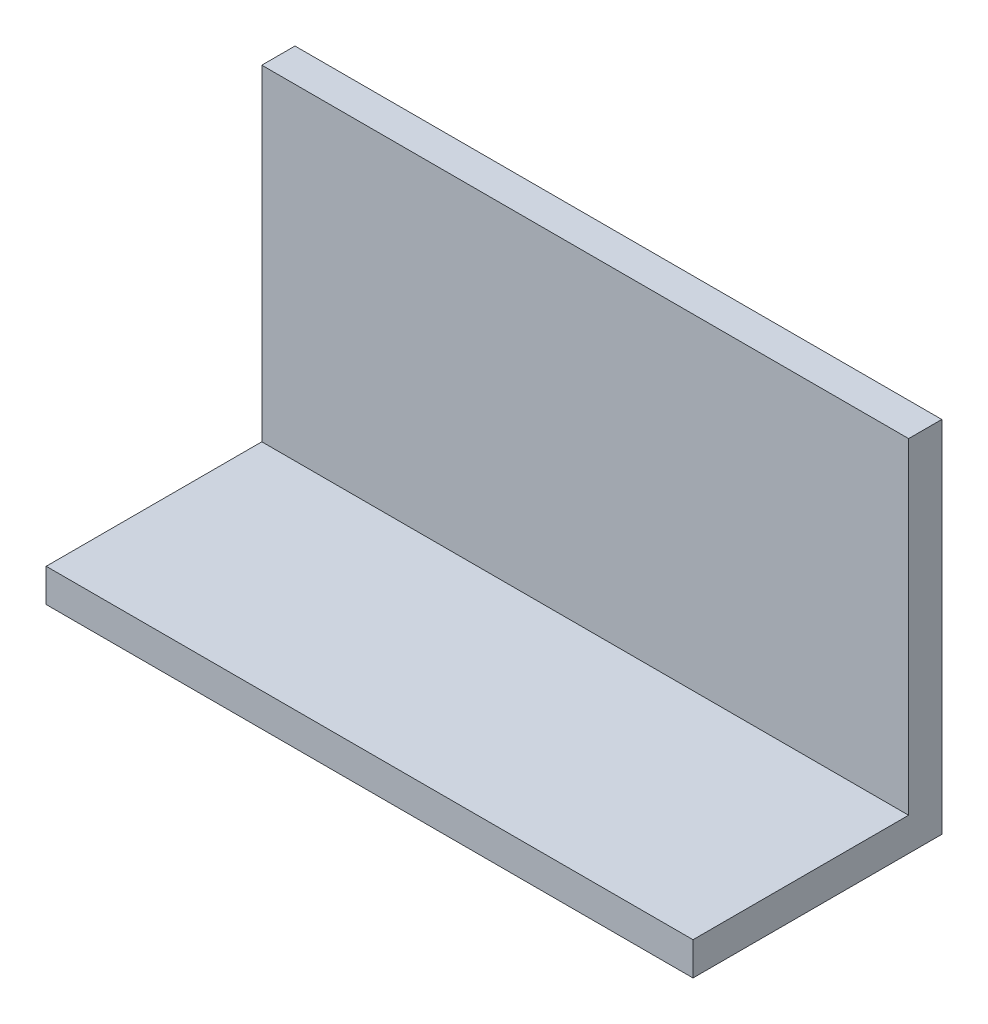
ISO-10303-21;
HEADER;
FILE_DESCRIPTION(('STEP AP214'),'2;1');
FILE_NAME('part.step','',(''),(''),'','','');
FILE_SCHEMA(('AUTOMOTIVE_DESIGN { 1 0 10303 214 1 1 1 1 }'));
ENDSEC;
DATA;
#1=APPLICATION_CONTEXT('core data for automotive mechanical design processes');
#2=APPLICATION_PROTOCOL_DEFINITION('international standard','automotive_design',2000,#1);
#3=PRODUCT_CONTEXT('',#1,'mechanical');
#4=PRODUCT('Part','Part','',(#3));
#5=PRODUCT_RELATED_PRODUCT_CATEGORY('part','',(#4));
#6=PRODUCT_DEFINITION_FORMATION('','',#4);
#7=PRODUCT_DEFINITION_CONTEXT('part definition',#1,'design');
#8=PRODUCT_DEFINITION('design','',#6,#7);
#9=PRODUCT_DEFINITION_SHAPE('','',#8);
#10=(LENGTH_UNIT() NAMED_UNIT(*) SI_UNIT(.MILLI.,.METRE.));
#11=(NAMED_UNIT(*) PLANE_ANGLE_UNIT() SI_UNIT($,.RADIAN.));
#12=(NAMED_UNIT(*) SI_UNIT($,.STERADIAN.) SOLID_ANGLE_UNIT());
#13=UNCERTAINTY_MEASURE_WITH_UNIT(LENGTH_MEASURE(1.E-05),#10,'distance_accuracy_value','');
#14=(GEOMETRIC_REPRESENTATION_CONTEXT(3) GLOBAL_UNCERTAINTY_ASSIGNED_CONTEXT((#13)) GLOBAL_UNIT_ASSIGNED_CONTEXT((#10,
#11,#12)) REPRESENTATION_CONTEXT('',''));
#15=CARTESIAN_POINT('',(0.,0.,0.));
#16=DIRECTION('',(0.,0.,1.));
#17=DIRECTION('',(1.,0.,0.));
#18=AXIS2_PLACEMENT_3D('',#15,#16,#17);
#19=CARTESIAN_POINT('',(0.,0.,90.));
#20=DIRECTION('',(1.,0.,0.));
#21=DIRECTION('',(0.,1.,0.));
#22=AXIS2_PLACEMENT_3D('',#19,#20,#21);
#23=PLANE('',#22);
#24=DIRECTION('',(0.,-1.,0.));
#25=VECTOR('',#24,1.);
#26=CARTESIAN_POINT('',(0.,0.,90.));
#27=LINE('',#26,#25);
#28=CARTESIAN_POINT('',(0.,12.,90.));
#29=VERTEX_POINT('',#28);
#30=CARTESIAN_POINT('',(0.,0.,90.));
#31=VERTEX_POINT('',#30);
#32=EDGE_CURVE('E96',#29,#31,#27,.T.);
#33=ORIENTED_EDGE('',*,*,#32,.F.);
#34=DIRECTION('',(0.,0.,1.));
#35=VECTOR('',#34,1.);
#36=CARTESIAN_POINT('',(0.,12.,90.));
#37=LINE('',#36,#35);
#38=CARTESIAN_POINT('',(0.,12.,12.));
#39=VERTEX_POINT('',#38);
#40=EDGE_CURVE('E46',#39,#29,#37,.T.);
#41=ORIENTED_EDGE('',*,*,#40,.F.);
#42=DIRECTION('',(0.,-1.,0.));
#43=VECTOR('',#42,1.);
#44=CARTESIAN_POINT('',(0.,130.,12.));
#45=LINE('',#44,#43);
#46=CARTESIAN_POINT('',(0.,130.,12.));
#47=VERTEX_POINT('',#46);
#48=EDGE_CURVE('E83',#47,#39,#45,.T.);
#49=ORIENTED_EDGE('',*,*,#48,.F.);
#50=DIRECTION('',(0.,0.,-1.));
#51=VECTOR('',#50,1.);
#52=CARTESIAN_POINT('',(0.,130.,90.));
#53=LINE('',#52,#51);
#54=CARTESIAN_POINT('',(0.,130.,0.));
#55=VERTEX_POINT('',#54);
#56=EDGE_CURVE('E75',#47,#55,#53,.T.);
#57=ORIENTED_EDGE('',*,*,#56,.T.);
#58=DIRECTION('',(0.,-1.,0.));
#59=VECTOR('',#58,1.);
#60=CARTESIAN_POINT('',(0.,0.,0.));
#61=LINE('',#60,#59);
#62=CARTESIAN_POINT('',(0.,0.,0.));
#63=VERTEX_POINT('',#62);
#64=EDGE_CURVE('E80',#55,#63,#61,.T.);
#65=ORIENTED_EDGE('',*,*,#64,.T.);
#66=DIRECTION('',(0.,0.,-1.));
#67=VECTOR('',#66,1.);
#68=CARTESIAN_POINT('',(0.,0.,90.));
#69=LINE('',#68,#67);
#70=EDGE_CURVE('E11',#31,#63,#69,.T.);
#71=ORIENTED_EDGE('',*,*,#70,.F.);
#72=EDGE_LOOP('',(#33,#41,#49,#57,#65,#71));
#73=FACE_BOUND('',#72,.T.);
#74=ADVANCED_FACE('F32',(#73),#23,.F.);
#75=CARTESIAN_POINT('',(0.,0.,90.));
#76=DIRECTION('',(0.,1.,0.));
#77=DIRECTION('',(0.,0.,1.));
#78=AXIS2_PLACEMENT_3D('',#75,#76,#77);
#79=PLANE('',#78);
#80=DIRECTION('',(1.,0.,0.));
#81=VECTOR('',#80,1.);
#82=CARTESIAN_POINT('',(0.,0.,0.));
#83=LINE('',#82,#81);
#84=CARTESIAN_POINT('',(234.,0.,0.));
#85=VERTEX_POINT('',#84);
#86=EDGE_CURVE('E100',#63,#85,#83,.T.);
#87=ORIENTED_EDGE('',*,*,#86,.T.);
#88=DIRECTION('',(0.,0.,-1.));
#89=VECTOR('',#88,1.);
#90=CARTESIAN_POINT('',(234.,0.,90.));
#91=LINE('',#90,#89);
#92=CARTESIAN_POINT('',(234.,0.,90.));
#93=VERTEX_POINT('',#92);
#94=EDGE_CURVE('E39',#93,#85,#91,.T.);
#95=ORIENTED_EDGE('',*,*,#94,.F.);
#96=DIRECTION('',(1.,0.,0.));
#97=VECTOR('',#96,1.);
#98=CARTESIAN_POINT('',(0.,0.,90.));
#99=LINE('',#98,#97);
#100=EDGE_CURVE('E55',#31,#93,#99,.T.);
#101=ORIENTED_EDGE('',*,*,#100,.F.);
#102=ORIENTED_EDGE('',*,*,#70,.T.);
#103=EDGE_LOOP('',(#87,#95,#101,#102));
#104=FACE_BOUND('',#103,.T.);
#105=ADVANCED_FACE('F117',(#104),#79,.F.);
#106=CARTESIAN_POINT('',(234.,0.,90.));
#107=DIRECTION('',(-1.,0.,0.));
#108=DIRECTION('',(0.,-1.,0.));
#109=AXIS2_PLACEMENT_3D('',#106,#107,#108);
#110=PLANE('',#109);
#111=DIRECTION('',(0.,-1.,0.));
#112=VECTOR('',#111,1.);
#113=CARTESIAN_POINT('',(234.,130.,12.));
#114=LINE('',#113,#112);
#115=CARTESIAN_POINT('',(234.,130.,12.));
#116=VERTEX_POINT('',#115);
#117=CARTESIAN_POINT('',(234.,12.0000000000001,12.));
#118=VERTEX_POINT('',#117);
#119=EDGE_CURVE('E127',#116,#118,#114,.T.);
#120=ORIENTED_EDGE('',*,*,#119,.T.);
#121=DIRECTION('',(0.,0.,1.));
#122=VECTOR('',#121,1.);
#123=CARTESIAN_POINT('',(234.,12.0000000000001,90.));
#124=LINE('',#123,#122);
#125=CARTESIAN_POINT('',(234.,12.0000000000001,90.));
#126=VERTEX_POINT('',#125);
#127=EDGE_CURVE('E124',#118,#126,#124,.T.);
#128=ORIENTED_EDGE('',*,*,#127,.T.);
#129=DIRECTION('',(0.,1.,0.));
#130=VECTOR('',#129,1.);
#131=CARTESIAN_POINT('',(234.,0.,90.));
#132=LINE('',#131,#130);
#133=EDGE_CURVE('E87',#93,#126,#132,.T.);
#134=ORIENTED_EDGE('',*,*,#133,.F.);
#135=ORIENTED_EDGE('',*,*,#94,.T.);
#136=DIRECTION('',(0.,1.,0.));
#137=VECTOR('',#136,1.);
#138=CARTESIAN_POINT('',(234.,0.,0.));
#139=LINE('',#138,#137);
#140=CARTESIAN_POINT('',(234.,130.,0.));
#141=VERTEX_POINT('',#140);
#142=EDGE_CURVE('E97',#85,#141,#139,.T.);
#143=ORIENTED_EDGE('',*,*,#142,.T.);
#144=DIRECTION('',(0.,0.,-1.));
#145=VECTOR('',#144,1.);
#146=CARTESIAN_POINT('',(234.,130.,90.));
#147=LINE('',#146,#145);
#148=EDGE_CURVE('E86',#116,#141,#147,.T.);
#149=ORIENTED_EDGE('',*,*,#148,.F.);
#150=EDGE_LOOP('',(#120,#128,#134,#135,#143,#149));
#151=FACE_BOUND('',#150,.T.);
#152=ADVANCED_FACE('F114',(#151),#110,.F.);
#153=CARTESIAN_POINT('',(0.,130.,90.));
#154=DIRECTION('',(0.,-1.,0.));
#155=DIRECTION('',(0.,0.,-1.));
#156=AXIS2_PLACEMENT_3D('',#153,#154,#155);
#157=PLANE('',#156);
#158=ORIENTED_EDGE('',*,*,#56,.F.);
#159=DIRECTION('',(-1.,0.,0.));
#160=VECTOR('',#159,1.);
#161=CARTESIAN_POINT('',(234.,130.,12.));
#162=LINE('',#161,#160);
#163=EDGE_CURVE('E121',#116,#47,#162,.T.);
#164=ORIENTED_EDGE('',*,*,#163,.F.);
#165=ORIENTED_EDGE('',*,*,#148,.T.);
#166=DIRECTION('',(-1.,0.,0.));
#167=VECTOR('',#166,1.);
#168=CARTESIAN_POINT('',(0.,130.,0.));
#169=LINE('',#168,#167);
#170=EDGE_CURVE('E90',#141,#55,#169,.T.);
#171=ORIENTED_EDGE('',*,*,#170,.T.);
#172=EDGE_LOOP('',(#158,#164,#165,#171));
#173=FACE_BOUND('',#172,.T.);
#174=ADVANCED_FACE('F91',(#173),#157,.F.);
#175=CARTESIAN_POINT('',(0.,0.,90.));
#176=DIRECTION('',(0.,0.,-1.));
#177=DIRECTION('',(-1.,0.,0.));
#178=AXIS2_PLACEMENT_3D('',#175,#176,#177);
#179=PLANE('',#178);
#180=ORIENTED_EDGE('',*,*,#133,.T.);
#181=DIRECTION('',(-1.,0.,0.));
#182=VECTOR('',#181,1.);
#183=CARTESIAN_POINT('',(234.,12.0000000000001,90.));
#184=LINE('',#183,#182);
#185=EDGE_CURVE('E101',#126,#29,#184,.T.);
#186=ORIENTED_EDGE('',*,*,#185,.T.);
#187=ORIENTED_EDGE('',*,*,#32,.T.);
#188=ORIENTED_EDGE('',*,*,#100,.T.);
#189=EDGE_LOOP('',(#180,#186,#187,#188));
#190=FACE_BOUND('',#189,.T.);
#191=ADVANCED_FACE('F142',(#190),#179,.F.);
#192=CARTESIAN_POINT('',(0.,0.,0.));
#193=DIRECTION('',(0.,0.,-1.));
#194=DIRECTION('',(-1.,0.,0.));
#195=AXIS2_PLACEMENT_3D('',#192,#193,#194);
#196=PLANE('',#195);
#197=ORIENTED_EDGE('',*,*,#64,.F.);
#198=ORIENTED_EDGE('',*,*,#170,.F.);
#199=ORIENTED_EDGE('',*,*,#142,.F.);
#200=ORIENTED_EDGE('',*,*,#86,.F.);
#201=EDGE_LOOP('',(#197,#198,#199,#200));
#202=FACE_BOUND('',#201,.T.);
#203=ADVANCED_FACE('F99',(#202),#196,.T.);
#204=CARTESIAN_POINT('',(234.,12.0000000000001,90.));
#205=DIRECTION('',(0.,-1.,0.));
#206=DIRECTION('',(1.,0.,0.));
#207=AXIS2_PLACEMENT_3D('',#204,#205,#206);
#208=PLANE('',#207);
#209=ORIENTED_EDGE('',*,*,#40,.T.);
#210=ORIENTED_EDGE('',*,*,#185,.F.);
#211=ORIENTED_EDGE('',*,*,#127,.F.);
#212=DIRECTION('',(-1.,0.,0.));
#213=VECTOR('',#212,1.);
#214=CARTESIAN_POINT('',(234.,12.0000000000001,12.));
#215=LINE('',#214,#213);
#216=EDGE_CURVE('E104',#118,#39,#215,.T.);
#217=ORIENTED_EDGE('',*,*,#216,.T.);
#218=EDGE_LOOP('',(#209,#210,#211,#217));
#219=FACE_BOUND('',#218,.T.);
#220=ADVANCED_FACE('F141',(#219),#208,.F.);
#221=CARTESIAN_POINT('',(234.,130.,12.));
#222=DIRECTION('',(0.,0.,-1.));
#223=DIRECTION('',(0.,1.,0.));
#224=AXIS2_PLACEMENT_3D('',#221,#222,#223);
#225=PLANE('',#224);
#226=ORIENTED_EDGE('',*,*,#48,.T.);
#227=ORIENTED_EDGE('',*,*,#216,.F.);
#228=ORIENTED_EDGE('',*,*,#119,.F.);
#229=ORIENTED_EDGE('',*,*,#163,.T.);
#230=EDGE_LOOP('',(#226,#227,#228,#229));
#231=FACE_BOUND('',#230,.T.);
#232=ADVANCED_FACE('F137',(#231),#225,.F.);
#233=CLOSED_SHELL('',(#74,#105,#152,#174,#191,#203,#220,#232));
#234=MANIFOLD_SOLID_BREP('B2',#233);
#235=ADVANCED_BREP_SHAPE_REPRESENTATION('',(#18,#234),#14);
#236=SHAPE_DEFINITION_REPRESENTATION(#9,#235);
ENDSEC;
END-ISO-10303-21;
